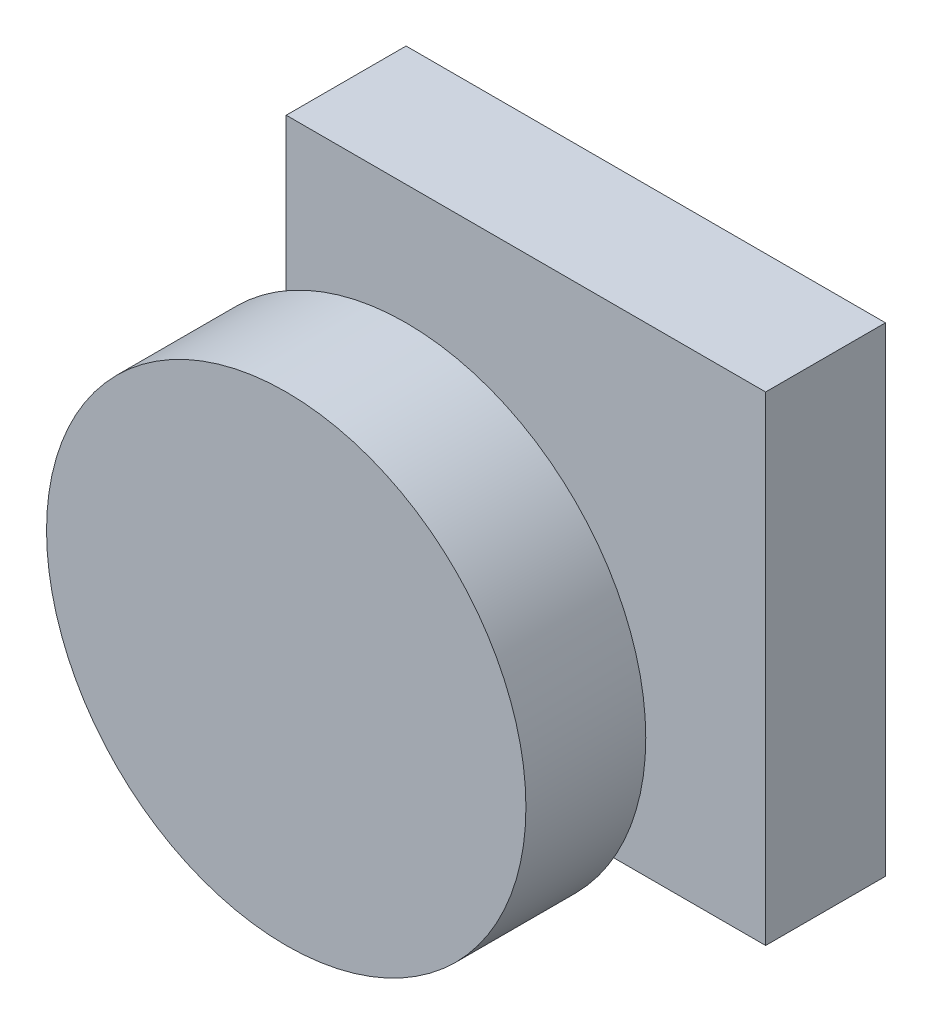
ISO-10303-21;
HEADER;
FILE_DESCRIPTION(('STEP AP214'),'2;1');
FILE_NAME('part.step','',(''),(''),'','','');
FILE_SCHEMA(('AUTOMOTIVE_DESIGN { 1 0 10303 214 1 1 1 1 }'));
ENDSEC;
DATA;
#1=APPLICATION_CONTEXT('core data for automotive mechanical design processes');
#2=APPLICATION_PROTOCOL_DEFINITION('international standard','automotive_design',2000,#1);
#3=PRODUCT_CONTEXT('',#1,'mechanical');
#4=PRODUCT('Part','Part','',(#3));
#5=PRODUCT_RELATED_PRODUCT_CATEGORY('part','',(#4));
#6=PRODUCT_DEFINITION_FORMATION('','',#4);
#7=PRODUCT_DEFINITION_CONTEXT('part definition',#1,'design');
#8=PRODUCT_DEFINITION('design','',#6,#7);
#9=PRODUCT_DEFINITION_SHAPE('','',#8);
#10=(LENGTH_UNIT() NAMED_UNIT(*) SI_UNIT(.MILLI.,.METRE.));
#11=(NAMED_UNIT(*) PLANE_ANGLE_UNIT() SI_UNIT($,.RADIAN.));
#12=(NAMED_UNIT(*) SI_UNIT($,.STERADIAN.) SOLID_ANGLE_UNIT());
#13=UNCERTAINTY_MEASURE_WITH_UNIT(LENGTH_MEASURE(1.E-05),#10,'distance_accuracy_value','');
#14=(GEOMETRIC_REPRESENTATION_CONTEXT(3) GLOBAL_UNCERTAINTY_ASSIGNED_CONTEXT((#13)) GLOBAL_UNIT_ASSIGNED_CONTEXT((#10,
#11,#12)) REPRESENTATION_CONTEXT('',''));
#15=CARTESIAN_POINT('',(0.,0.,0.));
#16=DIRECTION('',(0.,0.,1.));
#17=DIRECTION('',(1.,0.,0.));
#18=AXIS2_PLACEMENT_3D('',#15,#16,#17);
#19=CARTESIAN_POINT('',(-2.,2.,1.));
#20=DIRECTION('',(1.,0.,0.));
#21=DIRECTION('',(0.,1.,0.));
#22=AXIS2_PLACEMENT_3D('',#19,#20,#21);
#23=PLANE('',#22);
#24=DIRECTION('',(0.,-1.,0.));
#25=VECTOR('',#24,1.);
#26=CARTESIAN_POINT('',(-2.,2.,0.));
#27=LINE('',#26,#25);
#28=CARTESIAN_POINT('',(-2.,2.,0.));
#29=VERTEX_POINT('',#28);
#30=CARTESIAN_POINT('',(-2.,-2.,0.));
#31=VERTEX_POINT('',#30);
#32=EDGE_CURVE('E96',#29,#31,#27,.T.);
#33=ORIENTED_EDGE('',*,*,#32,.T.);
#34=DIRECTION('',(0.,0.,-1.));
#35=VECTOR('',#34,1.);
#36=CARTESIAN_POINT('',(-2.,-2.,1.));
#37=LINE('',#36,#35);
#38=CARTESIAN_POINT('',(-2.,-2.,1.));
#39=VERTEX_POINT('',#38);
#40=EDGE_CURVE('E11',#39,#31,#37,.T.);
#41=ORIENTED_EDGE('',*,*,#40,.F.);
#42=DIRECTION('',(0.,-1.,0.));
#43=VECTOR('',#42,1.);
#44=CARTESIAN_POINT('',(-2.,2.,1.));
#45=LINE('',#44,#43);
#46=CARTESIAN_POINT('',(-2.,2.,1.));
#47=VERTEX_POINT('',#46);
#48=EDGE_CURVE('E82',#47,#39,#45,.T.);
#49=ORIENTED_EDGE('',*,*,#48,.F.);
#50=DIRECTION('',(0.,0.,-1.));
#51=VECTOR('',#50,1.);
#52=CARTESIAN_POINT('',(-2.,2.,1.));
#53=LINE('',#52,#51);
#54=EDGE_CURVE('E49',#47,#29,#53,.T.);
#55=ORIENTED_EDGE('',*,*,#54,.T.);
#56=EDGE_LOOP('',(#33,#41,#49,#55));
#57=FACE_BOUND('',#56,.T.);
#58=ADVANCED_FACE('F33',(#57),#23,.F.);
#59=CARTESIAN_POINT('',(-2.,-2.,1.));
#60=DIRECTION('',(0.,1.,0.));
#61=DIRECTION('',(0.,0.,1.));
#62=AXIS2_PLACEMENT_3D('',#59,#60,#61);
#63=PLANE('',#62);
#64=DIRECTION('',(1.,0.,0.));
#65=VECTOR('',#64,1.);
#66=CARTESIAN_POINT('',(-2.,-2.,0.));
#67=LINE('',#66,#65);
#68=CARTESIAN_POINT('',(2.,-2.,0.));
#69=VERTEX_POINT('',#68);
#70=EDGE_CURVE('E87',#31,#69,#67,.T.);
#71=ORIENTED_EDGE('',*,*,#70,.T.);
#72=DIRECTION('',(0.,0.,-1.));
#73=VECTOR('',#72,1.);
#74=CARTESIAN_POINT('',(2.,-2.,1.));
#75=LINE('',#74,#73);
#76=CARTESIAN_POINT('',(2.,-2.,1.));
#77=VERTEX_POINT('',#76);
#78=EDGE_CURVE('E41',#77,#69,#75,.T.);
#79=ORIENTED_EDGE('',*,*,#78,.F.);
#80=DIRECTION('',(1.,0.,0.));
#81=VECTOR('',#80,1.);
#82=CARTESIAN_POINT('',(-2.,-2.,1.));
#83=LINE('',#82,#81);
#84=EDGE_CURVE('E74',#39,#77,#83,.T.);
#85=ORIENTED_EDGE('',*,*,#84,.F.);
#86=ORIENTED_EDGE('',*,*,#40,.T.);
#87=EDGE_LOOP('',(#71,#79,#85,#86));
#88=FACE_BOUND('',#87,.T.);
#89=ADVANCED_FACE('F86',(#88),#63,.F.);
#90=CARTESIAN_POINT('',(2.,2.,1.));
#91=DIRECTION('',(1.,0.,0.));
#92=DIRECTION('',(0.,1.,0.));
#93=AXIS2_PLACEMENT_3D('',#90,#91,#92);
#94=PLANE('',#93);
#95=DIRECTION('',(0.,-1.,0.));
#96=VECTOR('',#95,1.);
#97=CARTESIAN_POINT('',(2.,2.,0.));
#98=LINE('',#97,#96);
#99=CARTESIAN_POINT('',(2.,2.,0.));
#100=VERTEX_POINT('',#99);
#101=EDGE_CURVE('E100',#100,#69,#98,.T.);
#102=ORIENTED_EDGE('',*,*,#101,.F.);
#103=DIRECTION('',(0.,0.,-1.));
#104=VECTOR('',#103,1.);
#105=CARTESIAN_POINT('',(2.,2.,1.));
#106=LINE('',#105,#104);
#107=CARTESIAN_POINT('',(2.,2.,1.));
#108=VERTEX_POINT('',#107);
#109=EDGE_CURVE('E63',#108,#100,#106,.T.);
#110=ORIENTED_EDGE('',*,*,#109,.F.);
#111=DIRECTION('',(0.,-1.,0.));
#112=VECTOR('',#111,1.);
#113=CARTESIAN_POINT('',(2.,2.,1.));
#114=LINE('',#113,#112);
#115=EDGE_CURVE('E81',#108,#77,#114,.T.);
#116=ORIENTED_EDGE('',*,*,#115,.T.);
#117=ORIENTED_EDGE('',*,*,#78,.T.);
#118=EDGE_LOOP('',(#102,#110,#116,#117));
#119=FACE_BOUND('',#118,.T.);
#120=ADVANCED_FACE('F90',(#119),#94,.T.);
#121=CARTESIAN_POINT('',(-2.,2.,1.));
#122=DIRECTION('',(0.,1.,0.));
#123=DIRECTION('',(0.,0.,1.));
#124=AXIS2_PLACEMENT_3D('',#121,#122,#123);
#125=PLANE('',#124);
#126=DIRECTION('',(1.,0.,0.));
#127=VECTOR('',#126,1.);
#128=CARTESIAN_POINT('',(-2.,2.,0.));
#129=LINE('',#128,#127);
#130=EDGE_CURVE('E102',#29,#100,#129,.T.);
#131=ORIENTED_EDGE('',*,*,#130,.F.);
#132=ORIENTED_EDGE('',*,*,#54,.F.);
#133=DIRECTION('',(1.,0.,0.));
#134=VECTOR('',#133,1.);
#135=CARTESIAN_POINT('',(-2.,2.,1.));
#136=LINE('',#135,#134);
#137=EDGE_CURVE('E91',#47,#108,#136,.T.);
#138=ORIENTED_EDGE('',*,*,#137,.T.);
#139=ORIENTED_EDGE('',*,*,#109,.T.);
#140=EDGE_LOOP('',(#131,#132,#138,#139));
#141=FACE_BOUND('',#140,.T.);
#142=ADVANCED_FACE('F142',(#141),#125,.T.);
#143=CARTESIAN_POINT('',(0.,0.,1.));
#144=DIRECTION('',(0.,0.,1.));
#145=DIRECTION('',(1.,0.,0.));
#146=AXIS2_PLACEMENT_3D('',#143,#144,#145);
#147=PLANE('',#146);
#148=CARTESIAN_POINT('',(0.,0.,1.));
#149=DIRECTION('',(0.,0.,1.));
#150=DIRECTION('',(1.,0.,0.));
#151=AXIS2_PLACEMENT_3D('',#148,#149,#150);
#152=CIRCLE('',#151,0.4);
#153=CARTESIAN_POINT('',(0.4,0.,1.));
#154=VERTEX_POINT('',#153);
#155=EDGE_CURVE('E108',#154,#154,#152,.T.);
#156=ORIENTED_EDGE('',*,*,#155,.F.);
#157=EDGE_LOOP('',(#156));
#158=FACE_BOUND('',#157,.T.);
#159=ORIENTED_EDGE('',*,*,#48,.T.);
#160=ORIENTED_EDGE('',*,*,#84,.T.);
#161=ORIENTED_EDGE('',*,*,#115,.F.);
#162=ORIENTED_EDGE('',*,*,#137,.F.);
#163=EDGE_LOOP('',(#159,#160,#161,#162));
#164=FACE_BOUND('',#163,.T.);
#165=ADVANCED_FACE('F78',(#158,#164),#147,.T.);
#166=CARTESIAN_POINT('',(0.,0.,0.));
#167=DIRECTION('',(0.,0.,1.));
#168=DIRECTION('',(1.,0.,0.));
#169=AXIS2_PLACEMENT_3D('',#166,#167,#168);
#170=PLANE('',#169);
#171=ORIENTED_EDGE('',*,*,#32,.F.);
#172=ORIENTED_EDGE('',*,*,#130,.T.);
#173=ORIENTED_EDGE('',*,*,#101,.T.);
#174=ORIENTED_EDGE('',*,*,#70,.F.);
#175=EDGE_LOOP('',(#171,#172,#173,#174));
#176=FACE_BOUND('',#175,.T.);
#177=ADVANCED_FACE('F141',(#176),#170,.F.);
#178=CARTESIAN_POINT('',(0.,0.,2.));
#179=DIRECTION('',(0.,0.,-1.));
#180=DIRECTION('',(-1.,0.,0.));
#181=AXIS2_PLACEMENT_3D('',#178,#179,#180);
#182=CYLINDRICAL_SURFACE('',#181,0.4);
#183=CARTESIAN_POINT('',(0.,0.,2.));
#184=DIRECTION('',(0.,0.,1.));
#185=DIRECTION('',(1.,0.,0.));
#186=AXIS2_PLACEMENT_3D('',#183,#184,#185);
#187=CIRCLE('',#186,0.4);
#188=CARTESIAN_POINT('',(0.4,0.,2.));
#189=VERTEX_POINT('',#188);
#190=EDGE_CURVE('E98',#189,#189,#187,.T.);
#191=ORIENTED_EDGE('',*,*,#190,.F.);
#192=EDGE_LOOP('',(#191));
#193=FACE_BOUND('',#192,.T.);
#194=ORIENTED_EDGE('',*,*,#155,.T.);
#195=EDGE_LOOP('',(#194));
#196=FACE_BOUND('',#195,.T.);
#197=ADVANCED_FACE('F125',(#193,#196),#182,.T.);
#198=CARTESIAN_POINT('',(0.,0.,3.));
#199=DIRECTION('',(0.,0.,-1.));
#200=DIRECTION('',(-1.,0.,0.));
#201=AXIS2_PLACEMENT_3D('',#198,#199,#200);
#202=CYLINDRICAL_SURFACE('',#201,2.);
#203=CARTESIAN_POINT('',(0.,0.,3.));
#204=DIRECTION('',(0.,0.,1.));
#205=DIRECTION('',(1.,0.,0.));
#206=AXIS2_PLACEMENT_3D('',#203,#204,#205);
#207=CIRCLE('',#206,2.);
#208=CARTESIAN_POINT('',(2.,0.,3.));
#209=VERTEX_POINT('',#208);
#210=EDGE_CURVE('E111',#209,#209,#207,.T.);
#211=ORIENTED_EDGE('',*,*,#210,.F.);
#212=EDGE_LOOP('',(#211));
#213=FACE_BOUND('',#212,.T.);
#214=CARTESIAN_POINT('',(0.,0.,2.));
#215=DIRECTION('',(0.,0.,1.));
#216=DIRECTION('',(1.,0.,0.));
#217=AXIS2_PLACEMENT_3D('',#214,#215,#216);
#218=CIRCLE('',#217,2.);
#219=CARTESIAN_POINT('',(2.,0.,2.));
#220=VERTEX_POINT('',#219);
#221=EDGE_CURVE('E114',#220,#220,#218,.T.);
#222=ORIENTED_EDGE('',*,*,#221,.T.);
#223=EDGE_LOOP('',(#222));
#224=FACE_BOUND('',#223,.T.);
#225=ADVANCED_FACE('F122',(#213,#224),#202,.T.);
#226=CARTESIAN_POINT('',(0.,0.,3.));
#227=DIRECTION('',(0.,0.,1.));
#228=DIRECTION('',(1.,0.,0.));
#229=AXIS2_PLACEMENT_3D('',#226,#227,#228);
#230=PLANE('',#229);
#231=ORIENTED_EDGE('',*,*,#210,.T.);
#232=EDGE_LOOP('',(#231));
#233=FACE_BOUND('',#232,.T.);
#234=ADVANCED_FACE('F120',(#233),#230,.T.);
#235=CARTESIAN_POINT('',(0.,0.,2.));
#236=DIRECTION('',(0.,0.,1.));
#237=DIRECTION('',(1.,0.,0.));
#238=AXIS2_PLACEMENT_3D('',#235,#236,#237);
#239=PLANE('',#238);
#240=ORIENTED_EDGE('',*,*,#190,.T.);
#241=EDGE_LOOP('',(#240));
#242=FACE_BOUND('',#241,.T.);
#243=ORIENTED_EDGE('',*,*,#221,.F.);
#244=EDGE_LOOP('',(#243));
#245=FACE_BOUND('',#244,.T.);
#246=ADVANCED_FACE('F129',(#242,#245),#239,.F.);
#247=CLOSED_SHELL('',(#58,#89,#120,#142,#165,#177,#197,#225,#234,#246));
#248=MANIFOLD_SOLID_BREP('B2',#247);
#249=ADVANCED_BREP_SHAPE_REPRESENTATION('',(#18,#248),#14);
#250=SHAPE_DEFINITION_REPRESENTATION(#9,#249);
ENDSEC;
END-ISO-10303-21;
